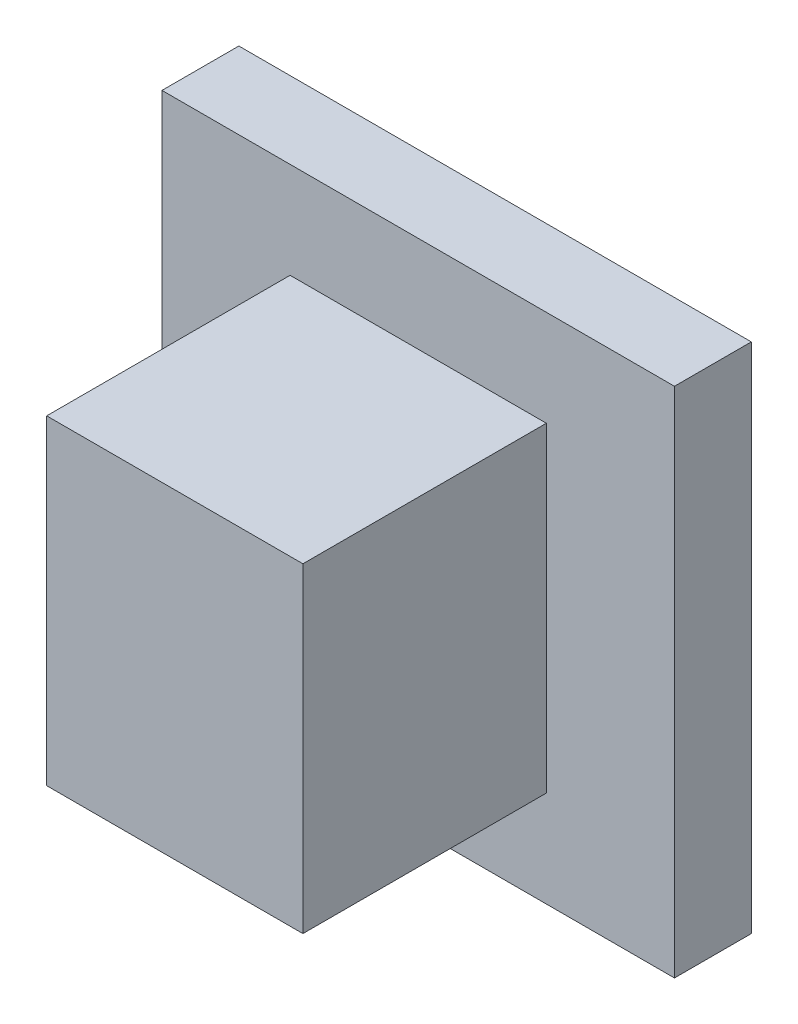
ISO-10303-21;
HEADER;
FILE_DESCRIPTION(('STEP AP214'),'2;1');
FILE_NAME('part.step','',(''),(''),'','','');
FILE_SCHEMA(('AUTOMOTIVE_DESIGN { 1 0 10303 214 1 1 1 1 }'));
ENDSEC;
DATA;
#1=APPLICATION_CONTEXT('core data for automotive mechanical design processes');
#2=APPLICATION_PROTOCOL_DEFINITION('international standard','automotive_design',2000,#1);
#3=PRODUCT_CONTEXT('',#1,'mechanical');
#4=PRODUCT('Part','Part','',(#3));
#5=PRODUCT_RELATED_PRODUCT_CATEGORY('part','',(#4));
#6=PRODUCT_DEFINITION_FORMATION('','',#4);
#7=PRODUCT_DEFINITION_CONTEXT('part definition',#1,'design');
#8=PRODUCT_DEFINITION('design','',#6,#7);
#9=PRODUCT_DEFINITION_SHAPE('','',#8);
#10=(LENGTH_UNIT() NAMED_UNIT(*) SI_UNIT(.MILLI.,.METRE.));
#11=(NAMED_UNIT(*) PLANE_ANGLE_UNIT() SI_UNIT($,.RADIAN.));
#12=(NAMED_UNIT(*) SI_UNIT($,.STERADIAN.) SOLID_ANGLE_UNIT());
#13=UNCERTAINTY_MEASURE_WITH_UNIT(LENGTH_MEASURE(1.E-05),#10,'distance_accuracy_value','');
#14=(GEOMETRIC_REPRESENTATION_CONTEXT(3) GLOBAL_UNCERTAINTY_ASSIGNED_CONTEXT((#13)) GLOBAL_UNIT_ASSIGNED_CONTEXT((#10,
#11,#12)) REPRESENTATION_CONTEXT('',''));
#15=CARTESIAN_POINT('',(0.,0.,0.));
#16=DIRECTION('',(0.,0.,1.));
#17=DIRECTION('',(1.,0.,0.));
#18=AXIS2_PLACEMENT_3D('',#15,#16,#17);
#19=CARTESIAN_POINT('',(3.,4.,4.));
#20=DIRECTION('',(-1.,0.,0.));
#21=DIRECTION('',(0.,-1.,0.));
#22=AXIS2_PLACEMENT_3D('',#19,#20,#21);
#23=PLANE('',#22);
#24=DIRECTION('',(0.,-1.,0.));
#25=VECTOR('',#24,1.);
#26=CARTESIAN_POINT('',(3.,5.5,1.2));
#27=LINE('',#26,#25);
#28=CARTESIAN_POINT('',(3.,4.,1.2));
#29=VERTEX_POINT('',#28);
#30=CARTESIAN_POINT('',(3.,-1.,1.2));
#31=VERTEX_POINT('',#30);
#32=EDGE_CURVE('E11',#29,#31,#27,.T.);
#33=ORIENTED_EDGE('',*,*,#32,.F.);
#34=DIRECTION('',(0.,0.,-1.));
#35=VECTOR('',#34,1.);
#36=CARTESIAN_POINT('',(3.,4.,4.));
#37=LINE('',#36,#35);
#38=CARTESIAN_POINT('',(3.,4.,5.));
#39=VERTEX_POINT('',#38);
#40=EDGE_CURVE('E225',#39,#29,#37,.T.);
#41=ORIENTED_EDGE('',*,*,#40,.F.);
#42=DIRECTION('',(0.,1.,0.));
#43=VECTOR('',#42,1.);
#44=CARTESIAN_POINT('',(3.,-1.,5.));
#45=LINE('',#44,#43);
#46=CARTESIAN_POINT('',(3.,-1.,5.));
#47=VERTEX_POINT('',#46);
#48=EDGE_CURVE('E169',#47,#39,#45,.T.);
#49=ORIENTED_EDGE('',*,*,#48,.F.);
#50=DIRECTION('',(0.,0.,-1.));
#51=VECTOR('',#50,1.);
#52=CARTESIAN_POINT('',(3.,-1.,4.));
#53=LINE('',#52,#51);
#54=EDGE_CURVE('E227',#47,#31,#53,.T.);
#55=ORIENTED_EDGE('',*,*,#54,.T.);
#56=EDGE_LOOP('',(#33,#41,#49,#55));
#57=FACE_BOUND('',#56,.T.);
#58=ADVANCED_FACE('F40',(#57),#23,.F.);
#59=CARTESIAN_POINT('',(-1.,4.,4.));
#60=DIRECTION('',(1.,0.,0.));
#61=DIRECTION('',(0.,1.,0.));
#62=AXIS2_PLACEMENT_3D('',#59,#60,#61);
#63=PLANE('',#62);
#64=DIRECTION('',(0.,-1.,0.));
#65=VECTOR('',#64,1.);
#66=CARTESIAN_POINT('',(-1.,4.,1.2));
#67=LINE('',#66,#65);
#68=CARTESIAN_POINT('',(-1.,4.,1.2));
#69=VERTEX_POINT('',#68);
#70=CARTESIAN_POINT('',(-0.999999999999999,-1.,1.2));
#71=VERTEX_POINT('',#70);
#72=EDGE_CURVE('E56',#69,#71,#67,.T.);
#73=ORIENTED_EDGE('',*,*,#72,.T.);
#74=DIRECTION('',(0.,0.,-1.));
#75=VECTOR('',#74,1.);
#76=CARTESIAN_POINT('',(-0.999999999999999,-1.,4.));
#77=LINE('',#76,#75);
#78=CARTESIAN_POINT('',(-0.999999999999999,-1.,5.));
#79=VERTEX_POINT('',#78);
#80=EDGE_CURVE('E44',#79,#71,#77,.T.);
#81=ORIENTED_EDGE('',*,*,#80,.F.);
#82=DIRECTION('',(0.,-1.,0.));
#83=VECTOR('',#82,1.);
#84=CARTESIAN_POINT('',(-1.,4.,5.));
#85=LINE('',#84,#83);
#86=CARTESIAN_POINT('',(-1.,4.,5.));
#87=VERTEX_POINT('',#86);
#88=EDGE_CURVE('E163',#87,#79,#85,.T.);
#89=ORIENTED_EDGE('',*,*,#88,.F.);
#90=DIRECTION('',(0.,0.,-1.));
#91=VECTOR('',#90,1.);
#92=CARTESIAN_POINT('',(-1.,4.,4.));
#93=LINE('',#92,#91);
#94=EDGE_CURVE('E223',#87,#69,#93,.T.);
#95=ORIENTED_EDGE('',*,*,#94,.T.);
#96=EDGE_LOOP('',(#73,#81,#89,#95));
#97=FACE_BOUND('',#96,.T.);
#98=ADVANCED_FACE('F42',(#97),#63,.F.);
#99=CARTESIAN_POINT('',(-0.999999999999999,-1.,4.));
#100=DIRECTION('',(0.,1.,0.));
#101=DIRECTION('',(0.,0.,1.));
#102=AXIS2_PLACEMENT_3D('',#99,#100,#101);
#103=PLANE('',#102);
#104=DIRECTION('',(1.,0.,0.));
#105=VECTOR('',#104,1.);
#106=CARTESIAN_POINT('',(-0.999999999999999,-1.,1.2));
#107=LINE('',#106,#105);
#108=EDGE_CURVE('E63',#71,#31,#107,.T.);
#109=ORIENTED_EDGE('',*,*,#108,.T.);
#110=ORIENTED_EDGE('',*,*,#54,.F.);
#111=DIRECTION('',(1.,0.,0.));
#112=VECTOR('',#111,1.);
#113=CARTESIAN_POINT('',(-0.999999999999999,-1.,5.));
#114=LINE('',#113,#112);
#115=EDGE_CURVE('E166',#79,#47,#114,.T.);
#116=ORIENTED_EDGE('',*,*,#115,.F.);
#117=ORIENTED_EDGE('',*,*,#80,.T.);
#118=EDGE_LOOP('',(#109,#110,#116,#117));
#119=FACE_BOUND('',#118,.T.);
#120=ADVANCED_FACE('F231',(#119),#103,.F.);
#121=CARTESIAN_POINT('',(-1.,4.,4.));
#122=DIRECTION('',(0.,-1.,0.));
#123=DIRECTION('',(0.,0.,-1.));
#124=AXIS2_PLACEMENT_3D('',#121,#122,#123);
#125=PLANE('',#124);
#126=DIRECTION('',(-1.,0.,0.));
#127=VECTOR('',#126,1.);
#128=CARTESIAN_POINT('',(3.,4.,1.2));
#129=LINE('',#128,#127);
#130=EDGE_CURVE('E172',#29,#69,#129,.T.);
#131=ORIENTED_EDGE('',*,*,#130,.T.);
#132=ORIENTED_EDGE('',*,*,#94,.F.);
#133=DIRECTION('',(-1.,0.,0.));
#134=VECTOR('',#133,1.);
#135=CARTESIAN_POINT('',(3.,4.,5.));
#136=LINE('',#135,#134);
#137=EDGE_CURVE('E160',#39,#87,#136,.T.);
#138=ORIENTED_EDGE('',*,*,#137,.F.);
#139=ORIENTED_EDGE('',*,*,#40,.T.);
#140=EDGE_LOOP('',(#131,#132,#138,#139));
#141=FACE_BOUND('',#140,.T.);
#142=ADVANCED_FACE('F237',(#141),#125,.F.);
#143=CARTESIAN_POINT('',(0.,0.,0.));
#144=DIRECTION('',(0.,0.,1.));
#145=DIRECTION('',(1.,0.,0.));
#146=AXIS2_PLACEMENT_3D('',#143,#144,#145);
#147=PLANE('',#146);
#148=DIRECTION('',(1.,0.,0.));
#149=VECTOR('',#148,1.);
#150=CARTESIAN_POINT('',(-3.,5.5,0.));
#151=LINE('',#150,#149);
#152=CARTESIAN_POINT('',(-3.,5.5,0.));
#153=VERTEX_POINT('',#152);
#154=CARTESIAN_POINT('',(5.,5.5,0.));
#155=VERTEX_POINT('',#154);
#156=EDGE_CURVE('E174',#153,#155,#151,.T.);
#157=ORIENTED_EDGE('',*,*,#156,.T.);
#158=DIRECTION('',(0.,-1.,0.));
#159=VECTOR('',#158,1.);
#160=CARTESIAN_POINT('',(5.,5.5,0.));
#161=LINE('',#160,#159);
#162=CARTESIAN_POINT('',(5.,-2.5,0.));
#163=VERTEX_POINT('',#162);
#164=EDGE_CURVE('E158',#155,#163,#161,.T.);
#165=ORIENTED_EDGE('',*,*,#164,.T.);
#166=DIRECTION('',(-1.,0.,0.));
#167=VECTOR('',#166,1.);
#168=CARTESIAN_POINT('',(3.,-2.5,0.));
#169=LINE('',#168,#167);
#170=CARTESIAN_POINT('',(-3.,-2.5,0.));
#171=VERTEX_POINT('',#170);
#172=EDGE_CURVE('E146',#163,#171,#169,.T.);
#173=ORIENTED_EDGE('',*,*,#172,.T.);
#174=DIRECTION('',(0.,1.,0.));
#175=VECTOR('',#174,1.);
#176=CARTESIAN_POINT('',(-3.,-2.5,0.));
#177=LINE('',#176,#175);
#178=EDGE_CURVE('E182',#171,#153,#177,.T.);
#179=ORIENTED_EDGE('',*,*,#178,.T.);
#180=EDGE_LOOP('',(#157,#165,#173,#179));
#181=FACE_BOUND('',#180,.T.);
#182=DIRECTION('',(0.,-1.,0.));
#183=VECTOR('',#182,1.);
#184=CARTESIAN_POINT('',(0.,0.,0.));
#185=LINE('',#184,#183);
#186=CARTESIAN_POINT('',(0.,3.,0.));
#187=VERTEX_POINT('',#186);
#188=CARTESIAN_POINT('',(0.,0.,0.));
#189=VERTEX_POINT('',#188);
#190=EDGE_CURVE('E188',#187,#189,#185,.T.);
#191=ORIENTED_EDGE('',*,*,#190,.T.);
#192=DIRECTION('',(1.,0.,0.));
#193=VECTOR('',#192,1.);
#194=CARTESIAN_POINT('',(0.,0.,0.));
#195=LINE('',#194,#193);
#196=CARTESIAN_POINT('',(2.,0.,0.));
#197=VERTEX_POINT('',#196);
#198=EDGE_CURVE('E206',#189,#197,#195,.T.);
#199=ORIENTED_EDGE('',*,*,#198,.T.);
#200=DIRECTION('',(0.,1.,0.));
#201=VECTOR('',#200,1.);
#202=CARTESIAN_POINT('',(2.,0.,0.));
#203=LINE('',#202,#201);
#204=CARTESIAN_POINT('',(2.,3.,0.));
#205=VERTEX_POINT('',#204);
#206=EDGE_CURVE('E209',#197,#205,#203,.T.);
#207=ORIENTED_EDGE('',*,*,#206,.T.);
#208=DIRECTION('',(-1.,0.,0.));
#209=VECTOR('',#208,1.);
#210=CARTESIAN_POINT('',(0.,3.,0.));
#211=LINE('',#210,#209);
#212=EDGE_CURVE('E194',#205,#187,#211,.T.);
#213=ORIENTED_EDGE('',*,*,#212,.T.);
#214=EDGE_LOOP('',(#191,#199,#207,#213));
#215=FACE_BOUND('',#214,.T.);
#216=ADVANCED_FACE('F251',(#181,#215),#147,.F.);
#217=CARTESIAN_POINT('',(0.,0.,4.));
#218=DIRECTION('',(1.,0.,0.));
#219=DIRECTION('',(0.,0.,-1.));
#220=AXIS2_PLACEMENT_3D('',#217,#218,#219);
#221=PLANE('',#220);
#222=ORIENTED_EDGE('',*,*,#190,.F.);
#223=DIRECTION('',(0.,0.,-1.));
#224=VECTOR('',#223,1.);
#225=CARTESIAN_POINT('',(0.,3.,4.));
#226=LINE('',#225,#224);
#227=CARTESIAN_POINT('',(0.,3.,4.));
#228=VERTEX_POINT('',#227);
#229=EDGE_CURVE('E203',#228,#187,#226,.T.);
#230=ORIENTED_EDGE('',*,*,#229,.F.);
#231=DIRECTION('',(0.,-1.,0.));
#232=VECTOR('',#231,1.);
#233=CARTESIAN_POINT('',(0.,0.,4.));
#234=LINE('',#233,#232);
#235=CARTESIAN_POINT('',(0.,0.,4.));
#236=VERTEX_POINT('',#235);
#237=EDGE_CURVE('E190',#228,#236,#234,.T.);
#238=ORIENTED_EDGE('',*,*,#237,.T.);
#239=DIRECTION('',(0.,0.,-1.));
#240=VECTOR('',#239,1.);
#241=CARTESIAN_POINT('',(0.,0.,4.));
#242=LINE('',#241,#240);
#243=EDGE_CURVE('E220',#236,#189,#242,.T.);
#244=ORIENTED_EDGE('',*,*,#243,.T.);
#245=EDGE_LOOP('',(#222,#230,#238,#244));
#246=FACE_BOUND('',#245,.T.);
#247=ADVANCED_FACE('F254',(#246),#221,.T.);
#248=CARTESIAN_POINT('',(0.,0.,4.));
#249=DIRECTION('',(0.,1.,0.));
#250=DIRECTION('',(0.,0.,1.));
#251=AXIS2_PLACEMENT_3D('',#248,#249,#250);
#252=PLANE('',#251);
#253=ORIENTED_EDGE('',*,*,#198,.F.);
#254=ORIENTED_EDGE('',*,*,#243,.F.);
#255=DIRECTION('',(1.,0.,0.));
#256=VECTOR('',#255,1.);
#257=CARTESIAN_POINT('',(0.,0.,4.));
#258=LINE('',#257,#256);
#259=CARTESIAN_POINT('',(2.,0.,4.));
#260=VERTEX_POINT('',#259);
#261=EDGE_CURVE('E193',#236,#260,#258,.T.);
#262=ORIENTED_EDGE('',*,*,#261,.T.);
#263=DIRECTION('',(0.,0.,-1.));
#264=VECTOR('',#263,1.);
#265=CARTESIAN_POINT('',(2.,0.,4.));
#266=LINE('',#265,#264);
#267=EDGE_CURVE('E218',#260,#197,#266,.T.);
#268=ORIENTED_EDGE('',*,*,#267,.T.);
#269=EDGE_LOOP('',(#253,#254,#262,#268));
#270=FACE_BOUND('',#269,.T.);
#271=ADVANCED_FACE('F258',(#270),#252,.T.);
#272=CARTESIAN_POINT('',(2.,0.,4.));
#273=DIRECTION('',(-1.,0.,0.));
#274=DIRECTION('',(0.,0.,1.));
#275=AXIS2_PLACEMENT_3D('',#272,#273,#274);
#276=PLANE('',#275);
#277=ORIENTED_EDGE('',*,*,#206,.F.);
#278=ORIENTED_EDGE('',*,*,#267,.F.);
#279=DIRECTION('',(0.,1.,0.));
#280=VECTOR('',#279,1.);
#281=CARTESIAN_POINT('',(2.,0.,4.));
#282=LINE('',#281,#280);
#283=CARTESIAN_POINT('',(2.,3.,4.));
#284=VERTEX_POINT('',#283);
#285=EDGE_CURVE('E197',#260,#284,#282,.T.);
#286=ORIENTED_EDGE('',*,*,#285,.T.);
#287=DIRECTION('',(0.,0.,-1.));
#288=VECTOR('',#287,1.);
#289=CARTESIAN_POINT('',(2.,3.,4.));
#290=LINE('',#289,#288);
#291=EDGE_CURVE('E216',#284,#205,#290,.T.);
#292=ORIENTED_EDGE('',*,*,#291,.T.);
#293=EDGE_LOOP('',(#277,#278,#286,#292));
#294=FACE_BOUND('',#293,.T.);
#295=ADVANCED_FACE('F262',(#294),#276,.T.);
#296=CARTESIAN_POINT('',(0.,3.,4.));
#297=DIRECTION('',(0.,-1.,0.));
#298=DIRECTION('',(0.,0.,-1.));
#299=AXIS2_PLACEMENT_3D('',#296,#297,#298);
#300=PLANE('',#299);
#301=ORIENTED_EDGE('',*,*,#212,.F.);
#302=ORIENTED_EDGE('',*,*,#291,.F.);
#303=DIRECTION('',(-1.,0.,0.));
#304=VECTOR('',#303,1.);
#305=CARTESIAN_POINT('',(0.,3.,4.));
#306=LINE('',#305,#304);
#307=EDGE_CURVE('E200',#284,#228,#306,.T.);
#308=ORIENTED_EDGE('',*,*,#307,.T.);
#309=ORIENTED_EDGE('',*,*,#229,.T.);
#310=EDGE_LOOP('',(#301,#302,#308,#309));
#311=FACE_BOUND('',#310,.T.);
#312=ADVANCED_FACE('F266',(#311),#300,.T.);
#313=CARTESIAN_POINT('',(-3.,5.5,1.2));
#314=DIRECTION('',(0.,1.,0.));
#315=DIRECTION('',(-1.,0.,0.));
#316=AXIS2_PLACEMENT_3D('',#313,#314,#315);
#317=PLANE('',#316);
#318=ORIENTED_EDGE('',*,*,#156,.F.);
#319=DIRECTION('',(0.,0.,-1.));
#320=VECTOR('',#319,1.);
#321=CARTESIAN_POINT('',(-3.,5.5,1.2));
#322=LINE('',#321,#320);
#323=CARTESIAN_POINT('',(-3.,5.5,1.2));
#324=VERTEX_POINT('',#323);
#325=EDGE_CURVE('E186',#324,#153,#322,.T.);
#326=ORIENTED_EDGE('',*,*,#325,.F.);
#327=DIRECTION('',(1.,0.,0.));
#328=VECTOR('',#327,1.);
#329=CARTESIAN_POINT('',(-3.,5.5,1.2));
#330=LINE('',#329,#328);
#331=CARTESIAN_POINT('',(5.,5.5,1.2));
#332=VERTEX_POINT('',#331);
#333=EDGE_CURVE('E178',#324,#332,#330,.T.);
#334=ORIENTED_EDGE('',*,*,#333,.T.);
#335=DIRECTION('',(0.,0.,1.));
#336=VECTOR('',#335,1.);
#337=CARTESIAN_POINT('',(5.,5.5,-8.24621125123532));
#338=LINE('',#337,#336);
#339=EDGE_CURVE('E150',#155,#332,#338,.T.);
#340=ORIENTED_EDGE('',*,*,#339,.F.);
#341=EDGE_LOOP('',(#318,#326,#334,#340));
#342=FACE_BOUND('',#341,.T.);
#343=ADVANCED_FACE('F270',(#342),#317,.T.);
#344=CARTESIAN_POINT('',(-3.,-2.5,1.2));
#345=DIRECTION('',(-1.,0.,0.));
#346=DIRECTION('',(0.,0.,1.));
#347=AXIS2_PLACEMENT_3D('',#344,#345,#346);
#348=PLANE('',#347);
#349=ORIENTED_EDGE('',*,*,#178,.F.);
#350=DIRECTION('',(0.,0.,-1.));
#351=VECTOR('',#350,1.);
#352=CARTESIAN_POINT('',(-3.,-2.5,1.2));
#353=LINE('',#352,#351);
#354=CARTESIAN_POINT('',(-3.,-2.5,1.2));
#355=VERTEX_POINT('',#354);
#356=EDGE_CURVE('E180',#355,#171,#353,.T.);
#357=ORIENTED_EDGE('',*,*,#356,.F.);
#358=DIRECTION('',(0.,1.,0.));
#359=VECTOR('',#358,1.);
#360=CARTESIAN_POINT('',(-3.,-2.5,1.2));
#361=LINE('',#360,#359);
#362=EDGE_CURVE('E139',#355,#324,#361,.T.);
#363=ORIENTED_EDGE('',*,*,#362,.T.);
#364=ORIENTED_EDGE('',*,*,#325,.T.);
#365=EDGE_LOOP('',(#349,#357,#363,#364));
#366=FACE_BOUND('',#365,.T.);
#367=ADVANCED_FACE('F274',(#366),#348,.T.);
#368=CARTESIAN_POINT('',(3.,-2.5,1.2));
#369=DIRECTION('',(0.,-1.,0.));
#370=DIRECTION('',(1.,0.,0.));
#371=AXIS2_PLACEMENT_3D('',#368,#369,#370);
#372=PLANE('',#371);
#373=ORIENTED_EDGE('',*,*,#172,.F.);
#374=DIRECTION('',(0.,0.,1.));
#375=VECTOR('',#374,1.);
#376=CARTESIAN_POINT('',(5.,-2.5,-8.24621125123532));
#377=LINE('',#376,#375);
#378=CARTESIAN_POINT('',(5.,-2.5,1.2));
#379=VERTEX_POINT('',#378);
#380=EDGE_CURVE('E143',#163,#379,#377,.T.);
#381=ORIENTED_EDGE('',*,*,#380,.T.);
#382=DIRECTION('',(-1.,0.,0.));
#383=VECTOR('',#382,1.);
#384=CARTESIAN_POINT('',(3.,-2.5,1.2));
#385=LINE('',#384,#383);
#386=EDGE_CURVE('E132',#379,#355,#385,.T.);
#387=ORIENTED_EDGE('',*,*,#386,.T.);
#388=ORIENTED_EDGE('',*,*,#356,.T.);
#389=EDGE_LOOP('',(#373,#381,#387,#388));
#390=FACE_BOUND('',#389,.T.);
#391=ADVANCED_FACE('F144',(#390),#372,.T.);
#392=CARTESIAN_POINT('',(0.,0.,1.2));
#393=DIRECTION('',(0.,0.,-1.));
#394=DIRECTION('',(-1.,0.,0.));
#395=AXIS2_PLACEMENT_3D('',#392,#393,#394);
#396=PLANE('',#395);
#397=ORIENTED_EDGE('',*,*,#130,.F.);
#398=ORIENTED_EDGE('',*,*,#32,.T.);
#399=ORIENTED_EDGE('',*,*,#108,.F.);
#400=ORIENTED_EDGE('',*,*,#72,.F.);
#401=EDGE_LOOP('',(#397,#398,#399,#400));
#402=FACE_BOUND('',#401,.T.);
#403=DIRECTION('',(0.,1.,0.));
#404=VECTOR('',#403,1.);
#405=CARTESIAN_POINT('',(5.,5.5,1.2));
#406=LINE('',#405,#404);
#407=EDGE_CURVE('E137',#379,#332,#406,.T.);
#408=ORIENTED_EDGE('',*,*,#407,.T.);
#409=ORIENTED_EDGE('',*,*,#333,.F.);
#410=ORIENTED_EDGE('',*,*,#362,.F.);
#411=ORIENTED_EDGE('',*,*,#386,.F.);
#412=EDGE_LOOP('',(#408,#409,#410,#411));
#413=FACE_BOUND('',#412,.T.);
#414=ADVANCED_FACE('F134',(#402,#413),#396,.F.);
#415=CARTESIAN_POINT('',(0.,0.,4.));
#416=DIRECTION('',(0.,0.,1.));
#417=DIRECTION('',(1.,0.,0.));
#418=AXIS2_PLACEMENT_3D('',#415,#416,#417);
#419=PLANE('',#418);
#420=ORIENTED_EDGE('',*,*,#261,.F.);
#421=ORIENTED_EDGE('',*,*,#237,.F.);
#422=ORIENTED_EDGE('',*,*,#307,.F.);
#423=ORIENTED_EDGE('',*,*,#285,.F.);
#424=EDGE_LOOP('',(#420,#421,#422,#423));
#425=FACE_BOUND('',#424,.T.);
#426=ADVANCED_FACE('F283',(#425),#419,.F.);
#427=CARTESIAN_POINT('',(0.,0.,5.));
#428=DIRECTION('',(0.,0.,1.));
#429=DIRECTION('',(1.,0.,0.));
#430=AXIS2_PLACEMENT_3D('',#427,#428,#429);
#431=PLANE('',#430);
#432=ORIENTED_EDGE('',*,*,#137,.T.);
#433=ORIENTED_EDGE('',*,*,#88,.T.);
#434=ORIENTED_EDGE('',*,*,#115,.T.);
#435=ORIENTED_EDGE('',*,*,#48,.T.);
#436=EDGE_LOOP('',(#432,#433,#434,#435));
#437=FACE_BOUND('',#436,.T.);
#438=ADVANCED_FACE('F239',(#437),#431,.T.);
#439=CARTESIAN_POINT('',(5.,5.5,-8.24621125123532));
#440=DIRECTION('',(1.,0.,0.));
#441=DIRECTION('',(0.,1.,0.));
#442=AXIS2_PLACEMENT_3D('',#439,#440,#441);
#443=PLANE('',#442);
#444=ORIENTED_EDGE('',*,*,#164,.F.);
#445=ORIENTED_EDGE('',*,*,#339,.T.);
#446=ORIENTED_EDGE('',*,*,#407,.F.);
#447=ORIENTED_EDGE('',*,*,#380,.F.);
#448=EDGE_LOOP('',(#444,#445,#446,#447));
#449=FACE_BOUND('',#448,.T.);
#450=ADVANCED_FACE('F153',(#449),#443,.T.);
#451=CLOSED_SHELL('',(#58,#98,#120,#142,#216,#247,#271,#295,#312,#343,#367,#391,#414,#426,#438,#450));
#452=MANIFOLD_SOLID_BREP('B2',#451);
#453=ADVANCED_BREP_SHAPE_REPRESENTATION('',(#18,#452),#14);
#454=SHAPE_DEFINITION_REPRESENTATION(#9,#453);
ENDSEC;
END-ISO-10303-21;
